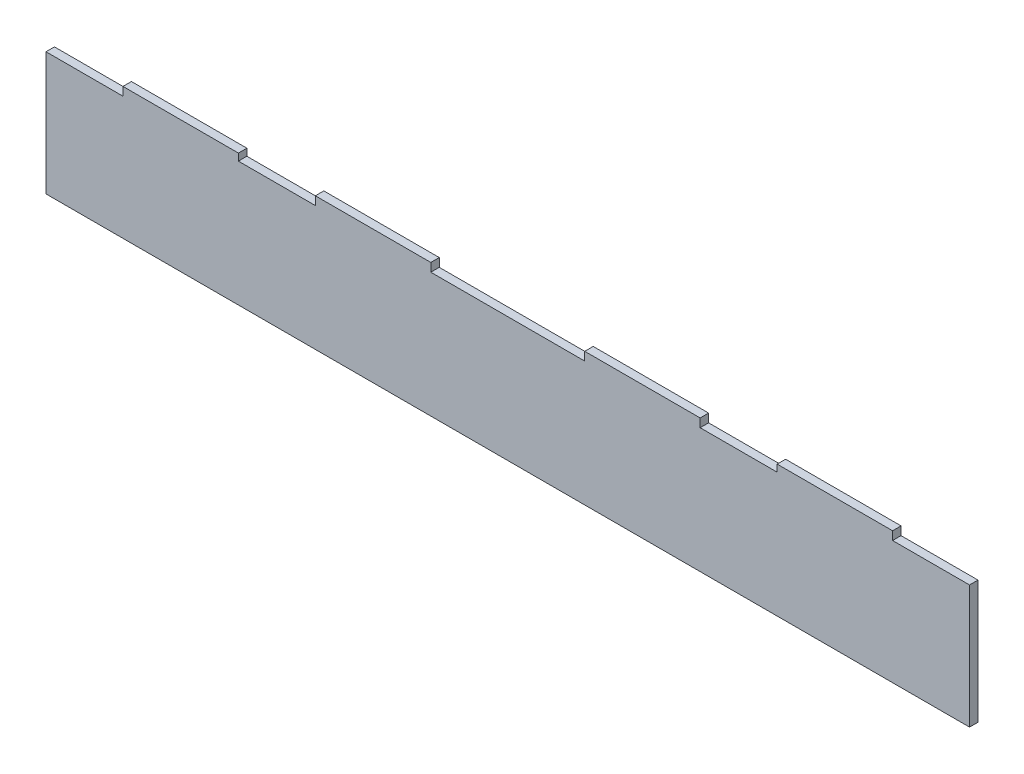
ISO-10303-21;
HEADER;
FILE_DESCRIPTION(('STEP AP214'),'2;1');
FILE_NAME('part.step','',(''),(''),'','','');
FILE_SCHEMA(('AUTOMOTIVE_DESIGN { 1 0 10303 214 1 1 1 1 }'));
ENDSEC;
DATA;
#1=APPLICATION_CONTEXT('core data for automotive mechanical design processes');
#2=APPLICATION_PROTOCOL_DEFINITION('international standard','automotive_design',2000,#1);
#3=PRODUCT_CONTEXT('',#1,'mechanical');
#4=PRODUCT('Part','Part','',(#3));
#5=PRODUCT_RELATED_PRODUCT_CATEGORY('part','',(#4));
#6=PRODUCT_DEFINITION_FORMATION('','',#4);
#7=PRODUCT_DEFINITION_CONTEXT('part definition',#1,'design');
#8=PRODUCT_DEFINITION('design','',#6,#7);
#9=PRODUCT_DEFINITION_SHAPE('','',#8);
#10=(LENGTH_UNIT() NAMED_UNIT(*) SI_UNIT(.MILLI.,.METRE.));
#11=(NAMED_UNIT(*) PLANE_ANGLE_UNIT() SI_UNIT($,.RADIAN.));
#12=(NAMED_UNIT(*) SI_UNIT($,.STERADIAN.) SOLID_ANGLE_UNIT());
#13=UNCERTAINTY_MEASURE_WITH_UNIT(LENGTH_MEASURE(1.E-05),#10,'distance_accuracy_value','');
#14=(GEOMETRIC_REPRESENTATION_CONTEXT(3) GLOBAL_UNCERTAINTY_ASSIGNED_CONTEXT((#13)) GLOBAL_UNIT_ASSIGNED_CONTEXT((#10,
#11,#12)) REPRESENTATION_CONTEXT('',''));
#15=CARTESIAN_POINT('',(0.,0.,0.));
#16=DIRECTION('',(0.,0.,1.));
#17=DIRECTION('',(1.,0.,0.));
#18=AXIS2_PLACEMENT_3D('',#15,#16,#17);
#19=CARTESIAN_POINT('',(85.3339901477832,65.2401002890128,5.588));
#20=DIRECTION('',(0.,-1.,0.));
#21=DIRECTION('',(0.,0.,-1.));
#22=AXIS2_PLACEMENT_3D('',#19,#20,#21);
#23=PLANE('',#22);
#24=DIRECTION('',(-1.,0.,0.));
#25=VECTOR('',#24,1.);
#26=CARTESIAN_POINT('',(85.3339901477832,65.2401002890128,0.));
#27=LINE('',#26,#25);
#28=CARTESIAN_POINT('',(186.933990147783,65.2401002890128,0.));
#29=VERTEX_POINT('',#28);
#30=CARTESIAN_POINT('',(85.3339901477832,65.2401002890128,0.));
#31=VERTEX_POINT('',#30);
#32=EDGE_CURVE('E201',#29,#31,#27,.T.);
#33=ORIENTED_EDGE('',*,*,#32,.T.);
#34=DIRECTION('',(0.,0.,-1.));
#35=VECTOR('',#34,1.);
#36=CARTESIAN_POINT('',(85.3339901477832,65.2401002890128,5.588));
#37=LINE('',#36,#35);
#38=CARTESIAN_POINT('',(85.3339901477832,65.2401002890128,5.588));
#39=VERTEX_POINT('',#38);
#40=EDGE_CURVE('E11',#39,#31,#37,.T.);
#41=ORIENTED_EDGE('',*,*,#40,.F.);
#42=DIRECTION('',(-1.,0.,0.));
#43=VECTOR('',#42,1.);
#44=CARTESIAN_POINT('',(85.3339901477832,65.2401002890128,5.588));
#45=LINE('',#44,#43);
#46=CARTESIAN_POINT('',(186.933990147783,65.2401002890128,5.588));
#47=VERTEX_POINT('',#46);
#48=EDGE_CURVE('E239',#47,#39,#45,.T.);
#49=ORIENTED_EDGE('',*,*,#48,.F.);
#50=DIRECTION('',(0.,0.,-1.));
#51=VECTOR('',#50,1.);
#52=CARTESIAN_POINT('',(186.933990147783,65.2401002890128,5.588));
#53=LINE('',#52,#51);
#54=EDGE_CURVE('E197',#47,#29,#53,.T.);
#55=ORIENTED_EDGE('',*,*,#54,.T.);
#56=EDGE_LOOP('',(#33,#41,#49,#55));
#57=FACE_BOUND('',#56,.T.);
#58=ADVANCED_FACE('F33',(#57),#23,.F.);
#59=CARTESIAN_POINT('',(85.3339901477832,70.8281002890126,5.588));
#60=DIRECTION('',(-1.,0.,0.));
#61=DIRECTION('',(0.,0.,1.));
#62=AXIS2_PLACEMENT_3D('',#59,#60,#61);
#63=PLANE('',#62);
#64=DIRECTION('',(0.,1.,0.));
#65=VECTOR('',#64,1.);
#66=CARTESIAN_POINT('',(85.3339901477832,70.8281002890126,0.));
#67=LINE('',#66,#65);
#68=CARTESIAN_POINT('',(85.3339901477832,70.8281002890126,0.));
#69=VERTEX_POINT('',#68);
#70=EDGE_CURVE('E204',#31,#69,#67,.T.);
#71=ORIENTED_EDGE('',*,*,#70,.T.);
#72=DIRECTION('',(0.,0.,-1.));
#73=VECTOR('',#72,1.);
#74=CARTESIAN_POINT('',(85.3339901477832,70.8281002890126,5.588));
#75=LINE('',#74,#73);
#76=CARTESIAN_POINT('',(85.3339901477832,70.8281002890126,5.588));
#77=VERTEX_POINT('',#76);
#78=EDGE_CURVE('E41',#77,#69,#75,.T.);
#79=ORIENTED_EDGE('',*,*,#78,.F.);
#80=DIRECTION('',(0.,1.,0.));
#81=VECTOR('',#80,1.);
#82=CARTESIAN_POINT('',(85.3339901477832,70.8281002890126,5.588));
#83=LINE('',#82,#81);
#84=EDGE_CURVE('E128',#39,#77,#83,.T.);
#85=ORIENTED_EDGE('',*,*,#84,.F.);
#86=ORIENTED_EDGE('',*,*,#40,.T.);
#87=EDGE_LOOP('',(#71,#79,#85,#86));
#88=FACE_BOUND('',#87,.T.);
#89=ADVANCED_FACE('F357',(#88),#63,.F.);
#90=CARTESIAN_POINT('',(9.13399014778317,70.8281002890126,5.588));
#91=DIRECTION('',(0.,-1.,0.));
#92=DIRECTION('',(1.,0.,0.));
#93=AXIS2_PLACEMENT_3D('',#90,#91,#92);
#94=PLANE('',#93);
#95=DIRECTION('',(-1.,0.,0.));
#96=VECTOR('',#95,1.);
#97=CARTESIAN_POINT('',(9.13399014778317,70.8281002890126,0.));
#98=LINE('',#97,#96);
#99=CARTESIAN_POINT('',(9.13399014778317,70.8281002890126,0.));
#100=VERTEX_POINT('',#99);
#101=EDGE_CURVE('E206',#69,#100,#98,.T.);
#102=ORIENTED_EDGE('',*,*,#101,.T.);
#103=DIRECTION('',(0.,0.,-1.));
#104=VECTOR('',#103,1.);
#105=CARTESIAN_POINT('',(9.13399014778317,70.8281002890126,5.588));
#106=LINE('',#105,#104);
#107=CARTESIAN_POINT('',(9.13399014778317,70.8281002890126,5.588));
#108=VERTEX_POINT('',#107);
#109=EDGE_CURVE('E282',#108,#100,#106,.T.);
#110=ORIENTED_EDGE('',*,*,#109,.F.);
#111=DIRECTION('',(-1.,0.,0.));
#112=VECTOR('',#111,1.);
#113=CARTESIAN_POINT('',(9.13399014778317,70.8281002890126,5.588));
#114=LINE('',#113,#112);
#115=EDGE_CURVE('E290',#77,#108,#114,.T.);
#116=ORIENTED_EDGE('',*,*,#115,.F.);
#117=ORIENTED_EDGE('',*,*,#78,.T.);
#118=EDGE_LOOP('',(#102,#110,#116,#117));
#119=FACE_BOUND('',#118,.T.);
#120=ADVANCED_FACE('F288',(#119),#94,.F.);
#121=CARTESIAN_POINT('',(9.13399014778317,70.8281002890126,5.588));
#122=DIRECTION('',(1.,0.,0.));
#123=DIRECTION('',(0.,0.,-1.));
#124=AXIS2_PLACEMENT_3D('',#121,#122,#123);
#125=PLANE('',#124);
#126=DIRECTION('',(0.,-1.,0.));
#127=VECTOR('',#126,1.);
#128=CARTESIAN_POINT('',(9.13399014778317,70.8281002890126,0.));
#129=LINE('',#128,#127);
#130=CARTESIAN_POINT('',(9.13399014778317,65.2401002890126,0.));
#131=VERTEX_POINT('',#130);
#132=EDGE_CURVE('E208',#100,#131,#129,.T.);
#133=ORIENTED_EDGE('',*,*,#132,.T.);
#134=DIRECTION('',(0.,0.,-1.));
#135=VECTOR('',#134,1.);
#136=CARTESIAN_POINT('',(9.13399014778317,65.2401002890126,5.588));
#137=LINE('',#136,#135);
#138=CARTESIAN_POINT('',(9.13399014778317,65.2401002890126,5.588));
#139=VERTEX_POINT('',#138);
#140=EDGE_CURVE('E279',#139,#131,#137,.T.);
#141=ORIENTED_EDGE('',*,*,#140,.F.);
#142=DIRECTION('',(0.,-1.,0.));
#143=VECTOR('',#142,1.);
#144=CARTESIAN_POINT('',(9.13399014778317,70.8281002890126,5.588));
#145=LINE('',#144,#143);
#146=EDGE_CURVE('E308',#108,#139,#145,.T.);
#147=ORIENTED_EDGE('',*,*,#146,.F.);
#148=ORIENTED_EDGE('',*,*,#109,.T.);
#149=EDGE_LOOP('',(#133,#141,#147,#148));
#150=FACE_BOUND('',#149,.T.);
#151=ADVANCED_FACE('F299',(#150),#125,.F.);
#152=CARTESIAN_POINT('',(-41.6660098522168,65.2401002890126,5.588));
#153=DIRECTION('',(0.,-1.,0.));
#154=DIRECTION('',(1.,0.,0.));
#155=AXIS2_PLACEMENT_3D('',#152,#153,#154);
#156=PLANE('',#155);
#157=DIRECTION('',(-1.,0.,0.));
#158=VECTOR('',#157,1.);
#159=CARTESIAN_POINT('',(-41.6660098522168,65.2401002890126,0.));
#160=LINE('',#159,#158);
#161=CARTESIAN_POINT('',(-41.6660098522168,65.2401002890126,0.));
#162=VERTEX_POINT('',#161);
#163=EDGE_CURVE('E210',#131,#162,#160,.T.);
#164=ORIENTED_EDGE('',*,*,#163,.T.);
#165=DIRECTION('',(0.,0.,-1.));
#166=VECTOR('',#165,1.);
#167=CARTESIAN_POINT('',(-41.6660098522168,65.2401002890126,5.588));
#168=LINE('',#167,#166);
#169=CARTESIAN_POINT('',(-41.6660098522168,65.2401002890126,5.588));
#170=VERTEX_POINT('',#169);
#171=EDGE_CURVE('E276',#170,#162,#168,.T.);
#172=ORIENTED_EDGE('',*,*,#171,.F.);
#173=DIRECTION('',(-1.,0.,0.));
#174=VECTOR('',#173,1.);
#175=CARTESIAN_POINT('',(-41.6660098522168,65.2401002890126,5.588));
#176=LINE('',#175,#174);
#177=EDGE_CURVE('E305',#139,#170,#176,.T.);
#178=ORIENTED_EDGE('',*,*,#177,.F.);
#179=ORIENTED_EDGE('',*,*,#140,.T.);
#180=EDGE_LOOP('',(#164,#172,#178,#179));
#181=FACE_BOUND('',#180,.T.);
#182=ADVANCED_FACE('F303',(#181),#156,.F.);
#183=CARTESIAN_POINT('',(-41.6660098522168,69.851251231527,5.588));
#184=DIRECTION('',(-1.,0.,0.));
#185=DIRECTION('',(0.,0.,1.));
#186=AXIS2_PLACEMENT_3D('',#183,#184,#185);
#187=PLANE('',#186);
#188=DIRECTION('',(0.,1.,0.));
#189=VECTOR('',#188,1.);
#190=CARTESIAN_POINT('',(-41.6660098522168,69.851251231527,0.));
#191=LINE('',#190,#189);
#192=CARTESIAN_POINT('',(-41.6660098522168,69.851251231527,0.));
#193=VERTEX_POINT('',#192);
#194=EDGE_CURVE('E212',#162,#193,#191,.T.);
#195=ORIENTED_EDGE('',*,*,#194,.T.);
#196=DIRECTION('',(0.,0.,-1.));
#197=VECTOR('',#196,1.);
#198=CARTESIAN_POINT('',(-41.6660098522168,69.851251231527,5.588));
#199=LINE('',#198,#197);
#200=CARTESIAN_POINT('',(-41.6660098522168,69.851251231527,5.588));
#201=VERTEX_POINT('',#200);
#202=EDGE_CURVE('E273',#201,#193,#199,.T.);
#203=ORIENTED_EDGE('',*,*,#202,.F.);
#204=DIRECTION('',(0.,1.,0.));
#205=VECTOR('',#204,1.);
#206=CARTESIAN_POINT('',(-41.6660098522168,69.851251231527,5.588));
#207=LINE('',#206,#205);
#208=EDGE_CURVE('E307',#170,#201,#207,.T.);
#209=ORIENTED_EDGE('',*,*,#208,.F.);
#210=ORIENTED_EDGE('',*,*,#171,.T.);
#211=EDGE_LOOP('',(#195,#203,#209,#210));
#212=FACE_BOUND('',#211,.T.);
#213=ADVANCED_FACE('F370',(#212),#187,.F.);
#214=CARTESIAN_POINT('',(-117.866009852217,69.8512512315271,5.588));
#215=DIRECTION('',(0.,-1.,0.));
#216=DIRECTION('',(1.,0.,0.));
#217=AXIS2_PLACEMENT_3D('',#214,#215,#216);
#218=PLANE('',#217);
#219=DIRECTION('',(-1.,0.,0.));
#220=VECTOR('',#219,1.);
#221=CARTESIAN_POINT('',(-117.866009852217,69.8512512315271,0.));
#222=LINE('',#221,#220);
#223=CARTESIAN_POINT('',(-117.866009852217,69.8512512315271,0.));
#224=VERTEX_POINT('',#223);
#225=EDGE_CURVE('E214',#193,#224,#222,.T.);
#226=ORIENTED_EDGE('',*,*,#225,.T.);
#227=DIRECTION('',(0.,0.,-1.));
#228=VECTOR('',#227,1.);
#229=CARTESIAN_POINT('',(-117.866009852217,69.8512512315271,5.588));
#230=LINE('',#229,#228);
#231=CARTESIAN_POINT('',(-117.866009852217,69.8512512315271,5.588));
#232=VERTEX_POINT('',#231);
#233=EDGE_CURVE('E270',#232,#224,#230,.T.);
#234=ORIENTED_EDGE('',*,*,#233,.F.);
#235=DIRECTION('',(-1.,0.,0.));
#236=VECTOR('',#235,1.);
#237=CARTESIAN_POINT('',(-117.866009852217,69.8512512315271,5.588));
#238=LINE('',#237,#236);
#239=EDGE_CURVE('E310',#201,#232,#238,.T.);
#240=ORIENTED_EDGE('',*,*,#239,.F.);
#241=ORIENTED_EDGE('',*,*,#202,.T.);
#242=EDGE_LOOP('',(#226,#234,#240,#241));
#243=FACE_BOUND('',#242,.T.);
#244=ADVANCED_FACE('F373',(#243),#218,.F.);
#245=CARTESIAN_POINT('',(-117.866009852217,69.8512512315271,5.588));
#246=DIRECTION('',(1.,0.,0.));
#247=DIRECTION('',(0.,1.,0.));
#248=AXIS2_PLACEMENT_3D('',#245,#246,#247);
#249=PLANE('',#248);
#250=DIRECTION('',(0.,-1.,0.));
#251=VECTOR('',#250,1.);
#252=CARTESIAN_POINT('',(-117.866009852217,69.8512512315271,0.));
#253=LINE('',#252,#251);
#254=CARTESIAN_POINT('',(-117.866009852217,64.2632512315271,0.));
#255=VERTEX_POINT('',#254);
#256=EDGE_CURVE('E216',#224,#255,#253,.T.);
#257=ORIENTED_EDGE('',*,*,#256,.T.);
#258=DIRECTION('',(0.,0.,-1.));
#259=VECTOR('',#258,1.);
#260=CARTESIAN_POINT('',(-117.866009852217,64.2632512315271,5.588));
#261=LINE('',#260,#259);
#262=CARTESIAN_POINT('',(-117.866009852217,64.2632512315271,5.588));
#263=VERTEX_POINT('',#262);
#264=EDGE_CURVE('E267',#263,#255,#261,.T.);
#265=ORIENTED_EDGE('',*,*,#264,.F.);
#266=DIRECTION('',(0.,-1.,0.));
#267=VECTOR('',#266,1.);
#268=CARTESIAN_POINT('',(-117.866009852217,69.8512512315271,5.588));
#269=LINE('',#268,#267);
#270=EDGE_CURVE('E316',#232,#263,#269,.T.);
#271=ORIENTED_EDGE('',*,*,#270,.F.);
#272=ORIENTED_EDGE('',*,*,#233,.T.);
#273=EDGE_LOOP('',(#257,#265,#271,#272));
#274=FACE_BOUND('',#273,.T.);
#275=ADVANCED_FACE('F377',(#274),#249,.F.);
#276=CARTESIAN_POINT('',(-168.666009852217,64.2632512315271,5.588));
#277=DIRECTION('',(0.,-1.,0.));
#278=DIRECTION('',(0.,0.,-1.));
#279=AXIS2_PLACEMENT_3D('',#276,#277,#278);
#280=PLANE('',#279);
#281=DIRECTION('',(-1.,0.,0.));
#282=VECTOR('',#281,1.);
#283=CARTESIAN_POINT('',(-168.666009852217,64.2632512315271,0.));
#284=LINE('',#283,#282);
#285=CARTESIAN_POINT('',(-168.666009852217,64.2632512315271,0.));
#286=VERTEX_POINT('',#285);
#287=EDGE_CURVE('E218',#255,#286,#284,.T.);
#288=ORIENTED_EDGE('',*,*,#287,.T.);
#289=DIRECTION('',(0.,0.,-1.));
#290=VECTOR('',#289,1.);
#291=CARTESIAN_POINT('',(-168.666009852217,64.2632512315271,5.588));
#292=LINE('',#291,#290);
#293=CARTESIAN_POINT('',(-168.666009852217,64.2632512315271,5.588));
#294=VERTEX_POINT('',#293);
#295=EDGE_CURVE('E264',#294,#286,#292,.T.);
#296=ORIENTED_EDGE('',*,*,#295,.F.);
#297=DIRECTION('',(-1.,0.,0.));
#298=VECTOR('',#297,1.);
#299=CARTESIAN_POINT('',(-168.666009852217,64.2632512315271,5.588));
#300=LINE('',#299,#298);
#301=EDGE_CURVE('E318',#263,#294,#300,.T.);
#302=ORIENTED_EDGE('',*,*,#301,.F.);
#303=ORIENTED_EDGE('',*,*,#264,.T.);
#304=EDGE_LOOP('',(#288,#296,#302,#303));
#305=FACE_BOUND('',#304,.T.);
#306=ADVANCED_FACE('F381',(#305),#280,.F.);
#307=CARTESIAN_POINT('',(-168.666009852217,-17.0167487684729,5.588));
#308=DIRECTION('',(1.,0.,0.));
#309=DIRECTION('',(0.,1.,0.));
#310=AXIS2_PLACEMENT_3D('',#307,#308,#309);
#311=PLANE('',#310);
#312=DIRECTION('',(0.,-1.,0.));
#313=VECTOR('',#312,1.);
#314=CARTESIAN_POINT('',(-168.666009852217,-17.0167487684729,0.));
#315=LINE('',#314,#313);
#316=CARTESIAN_POINT('',(-168.666009852217,-17.0167487684729,0.));
#317=VERTEX_POINT('',#316);
#318=EDGE_CURVE('E220',#286,#317,#315,.T.);
#319=ORIENTED_EDGE('',*,*,#318,.T.);
#320=DIRECTION('',(0.,0.,-1.));
#321=VECTOR('',#320,1.);
#322=CARTESIAN_POINT('',(-168.666009852217,-17.0167487684729,5.588));
#323=LINE('',#322,#321);
#324=CARTESIAN_POINT('',(-168.666009852217,-17.0167487684729,5.588));
#325=VERTEX_POINT('',#324);
#326=EDGE_CURVE('E261',#325,#317,#323,.T.);
#327=ORIENTED_EDGE('',*,*,#326,.F.);
#328=DIRECTION('',(0.,-1.,0.));
#329=VECTOR('',#328,1.);
#330=CARTESIAN_POINT('',(-168.666009852217,-17.0167487684729,5.588));
#331=LINE('',#330,#329);
#332=EDGE_CURVE('E320',#294,#325,#331,.T.);
#333=ORIENTED_EDGE('',*,*,#332,.F.);
#334=ORIENTED_EDGE('',*,*,#295,.T.);
#335=EDGE_LOOP('',(#319,#327,#333,#334));
#336=FACE_BOUND('',#335,.T.);
#337=ADVANCED_FACE('F385',(#336),#311,.F.);
#338=CARTESIAN_POINT('',(-168.666009852217,-17.0167487684729,5.588));
#339=DIRECTION('',(0.,1.,0.));
#340=DIRECTION('',(0.,0.,1.));
#341=AXIS2_PLACEMENT_3D('',#338,#339,#340);
#342=PLANE('',#341);
#343=DIRECTION('',(1.,0.,0.));
#344=VECTOR('',#343,1.);
#345=CARTESIAN_POINT('',(-168.666009852217,-17.0167487684729,0.));
#346=LINE('',#345,#344);
#347=CARTESIAN_POINT('',(440.933990147783,-17.0167487684729,0.));
#348=VERTEX_POINT('',#347);
#349=EDGE_CURVE('E222',#317,#348,#346,.T.);
#350=ORIENTED_EDGE('',*,*,#349,.T.);
#351=DIRECTION('',(0.,0.,-1.));
#352=VECTOR('',#351,1.);
#353=CARTESIAN_POINT('',(440.933990147783,-17.0167487684729,5.588));
#354=LINE('',#353,#352);
#355=CARTESIAN_POINT('',(440.933990147783,-17.0167487684729,5.588));
#356=VERTEX_POINT('',#355);
#357=EDGE_CURVE('E258',#356,#348,#354,.T.);
#358=ORIENTED_EDGE('',*,*,#357,.F.);
#359=DIRECTION('',(1.,0.,0.));
#360=VECTOR('',#359,1.);
#361=CARTESIAN_POINT('',(-168.666009852217,-17.0167487684729,5.588));
#362=LINE('',#361,#360);
#363=EDGE_CURVE('E322',#325,#356,#362,.T.);
#364=ORIENTED_EDGE('',*,*,#363,.F.);
#365=ORIENTED_EDGE('',*,*,#326,.T.);
#366=EDGE_LOOP('',(#350,#358,#364,#365));
#367=FACE_BOUND('',#366,.T.);
#368=ADVANCED_FACE('F389',(#367),#342,.F.);
#369=CARTESIAN_POINT('',(440.933990147783,-17.0167487684729,5.588));
#370=DIRECTION('',(-1.,0.,0.));
#371=DIRECTION('',(0.,-1.,0.));
#372=AXIS2_PLACEMENT_3D('',#369,#370,#371);
#373=PLANE('',#372);
#374=DIRECTION('',(0.,1.,0.));
#375=VECTOR('',#374,1.);
#376=CARTESIAN_POINT('',(440.933990147783,-17.0167487684729,0.));
#377=LINE('',#376,#375);
#378=CARTESIAN_POINT('',(440.933990147783,64.2632512315271,0.));
#379=VERTEX_POINT('',#378);
#380=EDGE_CURVE('E224',#348,#379,#377,.T.);
#381=ORIENTED_EDGE('',*,*,#380,.T.);
#382=DIRECTION('',(0.,0.,-1.));
#383=VECTOR('',#382,1.);
#384=CARTESIAN_POINT('',(440.933990147783,64.2632512315271,5.588));
#385=LINE('',#384,#383);
#386=CARTESIAN_POINT('',(440.933990147783,64.2632512315271,5.588));
#387=VERTEX_POINT('',#386);
#388=EDGE_CURVE('E255',#387,#379,#385,.T.);
#389=ORIENTED_EDGE('',*,*,#388,.F.);
#390=DIRECTION('',(0.,1.,0.));
#391=VECTOR('',#390,1.);
#392=CARTESIAN_POINT('',(440.933990147783,-17.0167487684729,5.588));
#393=LINE('',#392,#391);
#394=EDGE_CURVE('E324',#356,#387,#393,.T.);
#395=ORIENTED_EDGE('',*,*,#394,.F.);
#396=ORIENTED_EDGE('',*,*,#357,.T.);
#397=EDGE_LOOP('',(#381,#389,#395,#396));
#398=FACE_BOUND('',#397,.T.);
#399=ADVANCED_FACE('F393',(#398),#373,.F.);
#400=CARTESIAN_POINT('',(440.933990147783,64.2632512315271,5.588));
#401=DIRECTION('',(0.,-1.,0.));
#402=DIRECTION('',(0.,0.,-1.));
#403=AXIS2_PLACEMENT_3D('',#400,#401,#402);
#404=PLANE('',#403);
#405=DIRECTION('',(-1.,0.,0.));
#406=VECTOR('',#405,1.);
#407=CARTESIAN_POINT('',(440.933990147783,64.2632512315271,0.));
#408=LINE('',#407,#406);
#409=CARTESIAN_POINT('',(390.133990147783,64.2632512315271,0.));
#410=VERTEX_POINT('',#409);
#411=EDGE_CURVE('E226',#379,#410,#408,.T.);
#412=ORIENTED_EDGE('',*,*,#411,.T.);
#413=DIRECTION('',(0.,0.,-1.));
#414=VECTOR('',#413,1.);
#415=CARTESIAN_POINT('',(390.133990147783,64.2632512315271,5.588));
#416=LINE('',#415,#414);
#417=CARTESIAN_POINT('',(390.133990147783,64.2632512315271,5.588));
#418=VERTEX_POINT('',#417);
#419=EDGE_CURVE('E252',#418,#410,#416,.T.);
#420=ORIENTED_EDGE('',*,*,#419,.F.);
#421=DIRECTION('',(-1.,0.,0.));
#422=VECTOR('',#421,1.);
#423=CARTESIAN_POINT('',(440.933990147783,64.2632512315271,5.588));
#424=LINE('',#423,#422);
#425=EDGE_CURVE('E326',#387,#418,#424,.T.);
#426=ORIENTED_EDGE('',*,*,#425,.F.);
#427=ORIENTED_EDGE('',*,*,#388,.T.);
#428=EDGE_LOOP('',(#412,#420,#426,#427));
#429=FACE_BOUND('',#428,.T.);
#430=ADVANCED_FACE('F397',(#429),#404,.F.);
#431=CARTESIAN_POINT('',(390.133990147783,69.8512512315271,5.588));
#432=DIRECTION('',(-1.,0.,0.));
#433=DIRECTION('',(0.,0.,1.));
#434=AXIS2_PLACEMENT_3D('',#431,#432,#433);
#435=PLANE('',#434);
#436=DIRECTION('',(0.,1.,0.));
#437=VECTOR('',#436,1.);
#438=CARTESIAN_POINT('',(390.133990147783,69.8512512315271,0.));
#439=LINE('',#438,#437);
#440=CARTESIAN_POINT('',(390.133990147783,69.8512512315271,0.));
#441=VERTEX_POINT('',#440);
#442=EDGE_CURVE('E228',#410,#441,#439,.T.);
#443=ORIENTED_EDGE('',*,*,#442,.T.);
#444=DIRECTION('',(0.,0.,-1.));
#445=VECTOR('',#444,1.);
#446=CARTESIAN_POINT('',(390.133990147783,69.8512512315271,5.588));
#447=LINE('',#446,#445);
#448=CARTESIAN_POINT('',(390.133990147783,69.8512512315271,5.588));
#449=VERTEX_POINT('',#448);
#450=EDGE_CURVE('E249',#449,#441,#447,.T.);
#451=ORIENTED_EDGE('',*,*,#450,.F.);
#452=DIRECTION('',(0.,1.,0.));
#453=VECTOR('',#452,1.);
#454=CARTESIAN_POINT('',(390.133990147783,69.8512512315271,5.588));
#455=LINE('',#454,#453);
#456=EDGE_CURVE('E328',#418,#449,#455,.T.);
#457=ORIENTED_EDGE('',*,*,#456,.F.);
#458=ORIENTED_EDGE('',*,*,#419,.T.);
#459=EDGE_LOOP('',(#443,#451,#457,#458));
#460=FACE_BOUND('',#459,.T.);
#461=ADVANCED_FACE('F401',(#460),#435,.F.);
#462=CARTESIAN_POINT('',(390.133990147783,69.8512512315271,5.588));
#463=DIRECTION('',(0.,-1.,0.));
#464=DIRECTION('',(1.,0.,0.));
#465=AXIS2_PLACEMENT_3D('',#462,#463,#464);
#466=PLANE('',#465);
#467=DIRECTION('',(-1.,0.,0.));
#468=VECTOR('',#467,1.);
#469=CARTESIAN_POINT('',(390.133990147783,69.8512512315271,0.));
#470=LINE('',#469,#468);
#471=CARTESIAN_POINT('',(313.933990147783,69.851251231527,0.));
#472=VERTEX_POINT('',#471);
#473=EDGE_CURVE('E230',#441,#472,#470,.T.);
#474=ORIENTED_EDGE('',*,*,#473,.T.);
#475=DIRECTION('',(0.,0.,-1.));
#476=VECTOR('',#475,1.);
#477=CARTESIAN_POINT('',(313.933990147783,69.851251231527,5.588));
#478=LINE('',#477,#476);
#479=CARTESIAN_POINT('',(313.933990147783,69.851251231527,5.588));
#480=VERTEX_POINT('',#479);
#481=EDGE_CURVE('E246',#480,#472,#478,.T.);
#482=ORIENTED_EDGE('',*,*,#481,.F.);
#483=DIRECTION('',(-1.,0.,0.));
#484=VECTOR('',#483,1.);
#485=CARTESIAN_POINT('',(390.133990147783,69.8512512315271,5.588));
#486=LINE('',#485,#484);
#487=EDGE_CURVE('E330',#449,#480,#486,.T.);
#488=ORIENTED_EDGE('',*,*,#487,.F.);
#489=ORIENTED_EDGE('',*,*,#450,.T.);
#490=EDGE_LOOP('',(#474,#482,#488,#489));
#491=FACE_BOUND('',#490,.T.);
#492=ADVANCED_FACE('F405',(#491),#466,.F.);
#493=CARTESIAN_POINT('',(313.933990147783,69.851251231527,5.588));
#494=DIRECTION('',(1.,0.,0.));
#495=DIRECTION('',(0.,0.,-1.));
#496=AXIS2_PLACEMENT_3D('',#493,#494,#495);
#497=PLANE('',#496);
#498=DIRECTION('',(0.,-1.,0.));
#499=VECTOR('',#498,1.);
#500=CARTESIAN_POINT('',(313.933990147783,69.851251231527,0.));
#501=LINE('',#500,#499);
#502=CARTESIAN_POINT('',(313.933990147783,65.2401002890126,0.));
#503=VERTEX_POINT('',#502);
#504=EDGE_CURVE('E232',#472,#503,#501,.T.);
#505=ORIENTED_EDGE('',*,*,#504,.T.);
#506=DIRECTION('',(0.,0.,-1.));
#507=VECTOR('',#506,1.);
#508=CARTESIAN_POINT('',(313.933990147783,65.2401002890126,5.588));
#509=LINE('',#508,#507);
#510=CARTESIAN_POINT('',(313.933990147783,65.2401002890126,5.588));
#511=VERTEX_POINT('',#510);
#512=EDGE_CURVE('E243',#511,#503,#509,.T.);
#513=ORIENTED_EDGE('',*,*,#512,.F.);
#514=DIRECTION('',(0.,-1.,0.));
#515=VECTOR('',#514,1.);
#516=CARTESIAN_POINT('',(313.933990147783,69.851251231527,5.588));
#517=LINE('',#516,#515);
#518=EDGE_CURVE('E332',#480,#511,#517,.T.);
#519=ORIENTED_EDGE('',*,*,#518,.F.);
#520=ORIENTED_EDGE('',*,*,#481,.T.);
#521=EDGE_LOOP('',(#505,#513,#519,#520));
#522=FACE_BOUND('',#521,.T.);
#523=ADVANCED_FACE('F338',(#522),#497,.F.);
#524=CARTESIAN_POINT('',(313.933990147783,65.2401002890126,5.588));
#525=DIRECTION('',(0.,-1.,0.));
#526=DIRECTION('',(1.,0.,0.));
#527=AXIS2_PLACEMENT_3D('',#524,#525,#526);
#528=PLANE('',#527);
#529=DIRECTION('',(-1.,0.,0.));
#530=VECTOR('',#529,1.);
#531=CARTESIAN_POINT('',(313.933990147783,65.2401002890126,0.));
#532=LINE('',#531,#530);
#533=CARTESIAN_POINT('',(263.133990147783,65.2401002890126,0.));
#534=VERTEX_POINT('',#533);
#535=EDGE_CURVE('E234',#503,#534,#532,.T.);
#536=ORIENTED_EDGE('',*,*,#535,.T.);
#537=DIRECTION('',(0.,0.,-1.));
#538=VECTOR('',#537,1.);
#539=CARTESIAN_POINT('',(263.133990147783,65.2401002890126,5.588));
#540=LINE('',#539,#538);
#541=CARTESIAN_POINT('',(263.133990147783,65.2401002890126,5.588));
#542=VERTEX_POINT('',#541);
#543=EDGE_CURVE('E192',#542,#534,#540,.T.);
#544=ORIENTED_EDGE('',*,*,#543,.F.);
#545=DIRECTION('',(-1.,0.,0.));
#546=VECTOR('',#545,1.);
#547=CARTESIAN_POINT('',(313.933990147783,65.2401002890126,5.588));
#548=LINE('',#547,#546);
#549=EDGE_CURVE('E183',#511,#542,#548,.T.);
#550=ORIENTED_EDGE('',*,*,#549,.F.);
#551=ORIENTED_EDGE('',*,*,#512,.T.);
#552=EDGE_LOOP('',(#536,#544,#550,#551));
#553=FACE_BOUND('',#552,.T.);
#554=ADVANCED_FACE('F342',(#553),#528,.F.);
#555=CARTESIAN_POINT('',(263.133990147783,70.8281002890126,5.588));
#556=DIRECTION('',(-1.,0.,0.));
#557=DIRECTION('',(0.,0.,1.));
#558=AXIS2_PLACEMENT_3D('',#555,#556,#557);
#559=PLANE('',#558);
#560=DIRECTION('',(0.,1.,0.));
#561=VECTOR('',#560,1.);
#562=CARTESIAN_POINT('',(263.133990147783,70.8281002890126,0.));
#563=LINE('',#562,#561);
#564=CARTESIAN_POINT('',(263.133990147783,70.8281002890126,0.));
#565=VERTEX_POINT('',#564);
#566=EDGE_CURVE('E191',#534,#565,#563,.T.);
#567=ORIENTED_EDGE('',*,*,#566,.T.);
#568=DIRECTION('',(0.,0.,-1.));
#569=VECTOR('',#568,1.);
#570=CARTESIAN_POINT('',(263.133990147783,70.8281002890126,5.588));
#571=LINE('',#570,#569);
#572=CARTESIAN_POINT('',(263.133990147783,70.8281002890126,5.588));
#573=VERTEX_POINT('',#572);
#574=EDGE_CURVE('E188',#573,#565,#571,.T.);
#575=ORIENTED_EDGE('',*,*,#574,.F.);
#576=DIRECTION('',(0.,1.,0.));
#577=VECTOR('',#576,1.);
#578=CARTESIAN_POINT('',(263.133990147783,70.8281002890126,5.588));
#579=LINE('',#578,#577);
#580=EDGE_CURVE('E177',#542,#573,#579,.T.);
#581=ORIENTED_EDGE('',*,*,#580,.F.);
#582=ORIENTED_EDGE('',*,*,#543,.T.);
#583=EDGE_LOOP('',(#567,#575,#581,#582));
#584=FACE_BOUND('',#583,.T.);
#585=ADVANCED_FACE('F189',(#584),#559,.F.);
#586=CARTESIAN_POINT('',(263.133990147783,70.8281002890126,5.588));
#587=DIRECTION('',(0.,-1.,0.));
#588=DIRECTION('',(1.,0.,0.));
#589=AXIS2_PLACEMENT_3D('',#586,#587,#588);
#590=PLANE('',#589);
#591=DIRECTION('',(-1.,0.,0.));
#592=VECTOR('',#591,1.);
#593=CARTESIAN_POINT('',(263.133990147783,70.8281002890126,0.));
#594=LINE('',#593,#592);
#595=CARTESIAN_POINT('',(186.933990147783,70.8281002890126,0.));
#596=VERTEX_POINT('',#595);
#597=EDGE_CURVE('E114',#565,#596,#594,.T.);
#598=ORIENTED_EDGE('',*,*,#597,.T.);
#599=DIRECTION('',(0.,0.,-1.));
#600=VECTOR('',#599,1.);
#601=CARTESIAN_POINT('',(186.933990147783,70.8281002890126,5.588));
#602=LINE('',#601,#600);
#603=CARTESIAN_POINT('',(186.933990147783,70.8281002890126,5.588));
#604=VERTEX_POINT('',#603);
#605=EDGE_CURVE('E193',#604,#596,#602,.T.);
#606=ORIENTED_EDGE('',*,*,#605,.F.);
#607=DIRECTION('',(-1.,0.,0.));
#608=VECTOR('',#607,1.);
#609=CARTESIAN_POINT('',(263.133990147783,70.8281002890126,5.588));
#610=LINE('',#609,#608);
#611=EDGE_CURVE('E181',#573,#604,#610,.T.);
#612=ORIENTED_EDGE('',*,*,#611,.F.);
#613=ORIENTED_EDGE('',*,*,#574,.T.);
#614=EDGE_LOOP('',(#598,#606,#612,#613));
#615=FACE_BOUND('',#614,.T.);
#616=ADVANCED_FACE('F195',(#615),#590,.F.);
#617=CARTESIAN_POINT('',(186.933990147783,70.8281002890126,5.588));
#618=DIRECTION('',(1.,0.,0.));
#619=DIRECTION('',(0.,0.,-1.));
#620=AXIS2_PLACEMENT_3D('',#617,#618,#619);
#621=PLANE('',#620);
#622=DIRECTION('',(0.,-1.,0.));
#623=VECTOR('',#622,1.);
#624=CARTESIAN_POINT('',(186.933990147783,70.8281002890126,0.));
#625=LINE('',#624,#623);
#626=EDGE_CURVE('E120',#596,#29,#625,.T.);
#627=ORIENTED_EDGE('',*,*,#626,.T.);
#628=ORIENTED_EDGE('',*,*,#54,.F.);
#629=DIRECTION('',(0.,-1.,0.));
#630=VECTOR('',#629,1.);
#631=CARTESIAN_POINT('',(186.933990147783,70.8281002890126,5.588));
#632=LINE('',#631,#630);
#633=EDGE_CURVE('E49',#604,#47,#632,.T.);
#634=ORIENTED_EDGE('',*,*,#633,.F.);
#635=ORIENTED_EDGE('',*,*,#605,.T.);
#636=EDGE_LOOP('',(#627,#628,#634,#635));
#637=FACE_BOUND('',#636,.T.);
#638=ADVANCED_FACE('F346',(#637),#621,.F.);
#639=CARTESIAN_POINT('',(0.,0.,5.588));
#640=DIRECTION('',(0.,0.,-1.));
#641=DIRECTION('',(-1.,0.,0.));
#642=AXIS2_PLACEMENT_3D('',#639,#640,#641);
#643=PLANE('',#642);
#644=ORIENTED_EDGE('',*,*,#48,.T.);
#645=ORIENTED_EDGE('',*,*,#84,.T.);
#646=ORIENTED_EDGE('',*,*,#115,.T.);
#647=ORIENTED_EDGE('',*,*,#146,.T.);
#648=ORIENTED_EDGE('',*,*,#177,.T.);
#649=ORIENTED_EDGE('',*,*,#208,.T.);
#650=ORIENTED_EDGE('',*,*,#239,.T.);
#651=ORIENTED_EDGE('',*,*,#270,.T.);
#652=ORIENTED_EDGE('',*,*,#301,.T.);
#653=ORIENTED_EDGE('',*,*,#332,.T.);
#654=ORIENTED_EDGE('',*,*,#363,.T.);
#655=ORIENTED_EDGE('',*,*,#394,.T.);
#656=ORIENTED_EDGE('',*,*,#425,.T.);
#657=ORIENTED_EDGE('',*,*,#456,.T.);
#658=ORIENTED_EDGE('',*,*,#487,.T.);
#659=ORIENTED_EDGE('',*,*,#518,.T.);
#660=ORIENTED_EDGE('',*,*,#549,.T.);
#661=ORIENTED_EDGE('',*,*,#580,.T.);
#662=ORIENTED_EDGE('',*,*,#611,.T.);
#663=ORIENTED_EDGE('',*,*,#633,.T.);
#664=EDGE_LOOP('',(#644,#645,#646,#647,#648,#649,#650,#651,#652,#653,#654,#655,#656,#657,#658,
#659,#660,#661,#662,#663));
#665=FACE_BOUND('',#664,.T.);
#666=ADVANCED_FACE('F179',(#665),#643,.F.);
#667=CARTESIAN_POINT('',(0.,0.,0.));
#668=DIRECTION('',(0.,0.,-1.));
#669=DIRECTION('',(-1.,0.,0.));
#670=AXIS2_PLACEMENT_3D('',#667,#668,#669);
#671=PLANE('',#670);
#672=ORIENTED_EDGE('',*,*,#32,.F.);
#673=ORIENTED_EDGE('',*,*,#626,.F.);
#674=ORIENTED_EDGE('',*,*,#597,.F.);
#675=ORIENTED_EDGE('',*,*,#566,.F.);
#676=ORIENTED_EDGE('',*,*,#535,.F.);
#677=ORIENTED_EDGE('',*,*,#504,.F.);
#678=ORIENTED_EDGE('',*,*,#473,.F.);
#679=ORIENTED_EDGE('',*,*,#442,.F.);
#680=ORIENTED_EDGE('',*,*,#411,.F.);
#681=ORIENTED_EDGE('',*,*,#380,.F.);
#682=ORIENTED_EDGE('',*,*,#349,.F.);
#683=ORIENTED_EDGE('',*,*,#318,.F.);
#684=ORIENTED_EDGE('',*,*,#287,.F.);
#685=ORIENTED_EDGE('',*,*,#256,.F.);
#686=ORIENTED_EDGE('',*,*,#225,.F.);
#687=ORIENTED_EDGE('',*,*,#194,.F.);
#688=ORIENTED_EDGE('',*,*,#163,.F.);
#689=ORIENTED_EDGE('',*,*,#132,.F.);
#690=ORIENTED_EDGE('',*,*,#101,.F.);
#691=ORIENTED_EDGE('',*,*,#70,.F.);
#692=EDGE_LOOP('',(#672,#673,#674,#675,#676,#677,#678,#679,#680,#681,#682,#683,#684,#685,#686,
#687,#688,#689,#690,#691));
#693=FACE_BOUND('',#692,.T.);
#694=ADVANCED_FACE('F294',(#693),#671,.T.);
#695=CLOSED_SHELL('',(#58,#89,#120,#151,#182,#213,#244,#275,#306,#337,#368,#399,#430,#461,#492,
#523,#554,#585,#616,#638,#666,#694));
#696=MANIFOLD_SOLID_BREP('B2',#695);
#697=ADVANCED_BREP_SHAPE_REPRESENTATION('',(#18,#696),#14);
#698=SHAPE_DEFINITION_REPRESENTATION(#9,#697);
ENDSEC;
END-ISO-10303-21;
